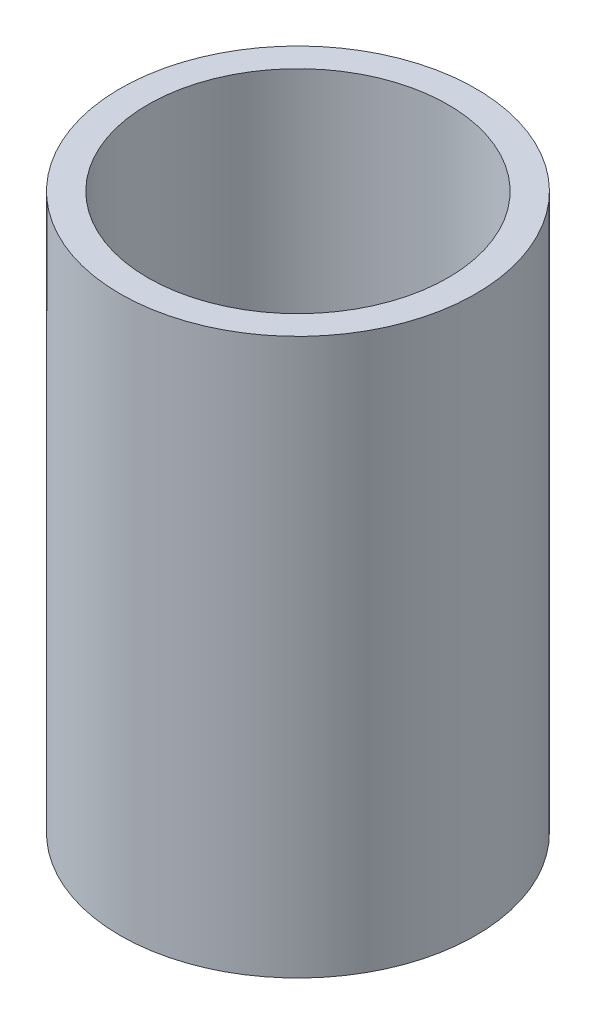
ISO-10303-21;
HEADER;
FILE_DESCRIPTION(('STEP AP214'),'2;1');
FILE_NAME('part.step','',(''),(''),'','','');
FILE_SCHEMA(('AUTOMOTIVE_DESIGN { 1 0 10303 214 1 1 1 1 }'));
ENDSEC;
DATA;
#1=APPLICATION_CONTEXT('core data for automotive mechanical design processes');
#2=APPLICATION_PROTOCOL_DEFINITION('international standard','automotive_design',2000,#1);
#3=PRODUCT_CONTEXT('',#1,'mechanical');
#4=PRODUCT('Part','Part','',(#3));
#5=PRODUCT_RELATED_PRODUCT_CATEGORY('part','',(#4));
#6=PRODUCT_DEFINITION_FORMATION('','',#4);
#7=PRODUCT_DEFINITION_CONTEXT('part definition',#1,'design');
#8=PRODUCT_DEFINITION('design','',#6,#7);
#9=PRODUCT_DEFINITION_SHAPE('','',#8);
#10=(LENGTH_UNIT() NAMED_UNIT(*) SI_UNIT(.MILLI.,.METRE.));
#11=(NAMED_UNIT(*) PLANE_ANGLE_UNIT() SI_UNIT($,.RADIAN.));
#12=(NAMED_UNIT(*) SI_UNIT($,.STERADIAN.) SOLID_ANGLE_UNIT());
#13=UNCERTAINTY_MEASURE_WITH_UNIT(LENGTH_MEASURE(1.E-05),#10,'distance_accuracy_value','');
#14=(GEOMETRIC_REPRESENTATION_CONTEXT(3) GLOBAL_UNCERTAINTY_ASSIGNED_CONTEXT((#13)) GLOBAL_UNIT_ASSIGNED_CONTEXT((#10,
#11,#12)) REPRESENTATION_CONTEXT('',''));
#15=CARTESIAN_POINT('',(0.,0.,0.));
#16=DIRECTION('',(0.,0.,1.));
#17=DIRECTION('',(1.,0.,0.));
#18=AXIS2_PLACEMENT_3D('',#15,#16,#17);
#19=CARTESIAN_POINT('',(0.,100.,0.));
#20=DIRECTION('',(0.,-1.,0.));
#21=DIRECTION('',(0.,0.,-1.));
#22=AXIS2_PLACEMENT_3D('',#19,#20,#21);
#23=CYLINDRICAL_SURFACE('',#22,32.);
#24=CARTESIAN_POINT('',(0.,100.,0.));
#25=DIRECTION('',(0.,1.,0.));
#26=DIRECTION('',(0.,0.,1.));
#27=AXIS2_PLACEMENT_3D('',#24,#25,#26);
#28=CIRCLE('',#27,32.);
#29=CARTESIAN_POINT('',(0.,100.,32.));
#30=VERTEX_POINT('',#29);
#31=EDGE_CURVE('E123',#30,#30,#28,.T.);
#32=ORIENTED_EDGE('',*,*,#31,.F.);
#33=EDGE_LOOP('',(#32));
#34=FACE_BOUND('',#33,.T.);
#35=CARTESIAN_POINT('',(0.,0.,0.));
#36=DIRECTION('',(0.,1.,0.));
#37=DIRECTION('',(0.,0.,1.));
#38=AXIS2_PLACEMENT_3D('',#35,#36,#37);
#39=CIRCLE('',#38,32.);
#40=CARTESIAN_POINT('',(0.,0.,32.));
#41=VERTEX_POINT('',#40);
#42=EDGE_CURVE('E119',#41,#41,#39,.T.);
#43=ORIENTED_EDGE('',*,*,#42,.T.);
#44=EDGE_LOOP('',(#43));
#45=FACE_BOUND('',#44,.T.);
#46=ADVANCED_FACE('F39',(#34,#45),#23,.T.);
#47=CARTESIAN_POINT('',(0.,100.,0.));
#48=DIRECTION('',(0.,1.,0.));
#49=DIRECTION('',(0.,0.,1.));
#50=AXIS2_PLACEMENT_3D('',#47,#48,#49);
#51=PLANE('',#50);
#52=CARTESIAN_POINT('',(0.,100.,0.));
#53=DIRECTION('',(0.,1.,0.));
#54=DIRECTION('',(0.,0.,1.));
#55=AXIS2_PLACEMENT_3D('',#52,#53,#54);
#56=CIRCLE('',#55,27.);
#57=CARTESIAN_POINT('',(0.,100.,27.));
#58=VERTEX_POINT('',#57);
#59=EDGE_CURVE('E110',#58,#58,#56,.T.);
#60=ORIENTED_EDGE('',*,*,#59,.F.);
#61=EDGE_LOOP('',(#60));
#62=FACE_BOUND('',#61,.T.);
#63=ORIENTED_EDGE('',*,*,#31,.T.);
#64=EDGE_LOOP('',(#63));
#65=FACE_BOUND('',#64,.T.);
#66=ADVANCED_FACE('F156',(#62,#65),#51,.T.);
#67=CARTESIAN_POINT('',(0.,0.,0.));
#68=DIRECTION('',(0.,1.,0.));
#69=DIRECTION('',(0.,0.,1.));
#70=AXIS2_PLACEMENT_3D('',#67,#68,#69);
#71=PLANE('',#70);
#72=DIRECTION('',(-1.,0.,0.));
#73=VECTOR('',#72,1.);
#74=CARTESIAN_POINT('',(-14.,0.,14.));
#75=LINE('',#74,#73);
#76=CARTESIAN_POINT('',(14.,0.,14.));
#77=VERTEX_POINT('',#76);
#78=CARTESIAN_POINT('',(-14.,0.,14.));
#79=VERTEX_POINT('',#78);
#80=EDGE_CURVE('E92',#77,#79,#75,.T.);
#81=ORIENTED_EDGE('',*,*,#80,.F.);
#82=DIRECTION('',(0.,0.,1.));
#83=VECTOR('',#82,1.);
#84=CARTESIAN_POINT('',(14.,0.,14.));
#85=LINE('',#84,#83);
#86=CARTESIAN_POINT('',(14.,0.,-14.));
#87=VERTEX_POINT('',#86);
#88=EDGE_CURVE('E54',#87,#77,#85,.T.);
#89=ORIENTED_EDGE('',*,*,#88,.F.);
#90=DIRECTION('',(1.,0.,0.));
#91=VECTOR('',#90,1.);
#92=CARTESIAN_POINT('',(-14.,0.,-14.));
#93=LINE('',#92,#91);
#94=CARTESIAN_POINT('',(-14.,0.,-14.));
#95=VERTEX_POINT('',#94);
#96=EDGE_CURVE('E100',#95,#87,#93,.T.);
#97=ORIENTED_EDGE('',*,*,#96,.F.);
#98=DIRECTION('',(0.,0.,-1.));
#99=VECTOR('',#98,1.);
#100=CARTESIAN_POINT('',(-14.,0.,14.));
#101=LINE('',#100,#99);
#102=EDGE_CURVE('E82',#79,#95,#101,.T.);
#103=ORIENTED_EDGE('',*,*,#102,.F.);
#104=EDGE_LOOP('',(#81,#89,#97,#103));
#105=FACE_BOUND('',#104,.T.);
#106=ORIENTED_EDGE('',*,*,#42,.F.);
#107=EDGE_LOOP('',(#106));
#108=FACE_BOUND('',#107,.T.);
#109=ADVANCED_FACE('F97',(#105,#108),#71,.F.);
#110=CARTESIAN_POINT('',(0.,15.,0.));
#111=DIRECTION('',(0.,1.,0.));
#112=DIRECTION('',(0.,0.,1.));
#113=AXIS2_PLACEMENT_3D('',#110,#111,#112);
#114=CYLINDRICAL_SURFACE('',#113,27.);
#115=CARTESIAN_POINT('',(0.,15.,0.));
#116=DIRECTION('',(0.,1.,0.));
#117=DIRECTION('',(0.,0.,1.));
#118=AXIS2_PLACEMENT_3D('',#115,#116,#117);
#119=CIRCLE('',#118,27.);
#120=CARTESIAN_POINT('',(0.,15.,27.));
#121=VERTEX_POINT('',#120);
#122=EDGE_CURVE('E115',#121,#121,#119,.T.);
#123=ORIENTED_EDGE('',*,*,#122,.F.);
#124=EDGE_LOOP('',(#123));
#125=FACE_BOUND('',#124,.T.);
#126=ORIENTED_EDGE('',*,*,#59,.T.);
#127=EDGE_LOOP('',(#126));
#128=FACE_BOUND('',#127,.T.);
#129=ADVANCED_FACE('F152',(#125,#128),#114,.F.);
#130=CARTESIAN_POINT('',(0.,15.,0.));
#131=DIRECTION('',(0.,1.,0.));
#132=DIRECTION('',(0.,0.,1.));
#133=AXIS2_PLACEMENT_3D('',#130,#131,#132);
#134=PLANE('',#133);
#135=DIRECTION('',(0.,0.,-1.));
#136=VECTOR('',#135,1.);
#137=CARTESIAN_POINT('',(14.,15.,0.));
#138=LINE('',#137,#136);
#139=CARTESIAN_POINT('',(14.,15.,14.));
#140=VERTEX_POINT('',#139);
#141=CARTESIAN_POINT('',(14.,15.,-14.));
#142=VERTEX_POINT('',#141);
#143=EDGE_CURVE('E11',#140,#142,#138,.T.);
#144=ORIENTED_EDGE('',*,*,#143,.F.);
#145=DIRECTION('',(1.,0.,0.));
#146=VECTOR('',#145,1.);
#147=CARTESIAN_POINT('',(0.,15.,14.));
#148=LINE('',#147,#146);
#149=CARTESIAN_POINT('',(-14.,15.,14.));
#150=VERTEX_POINT('',#149);
#151=EDGE_CURVE('E127',#150,#140,#148,.T.);
#152=ORIENTED_EDGE('',*,*,#151,.F.);
#153=DIRECTION('',(0.,0.,1.));
#154=VECTOR('',#153,1.);
#155=CARTESIAN_POINT('',(-14.,15.,0.));
#156=LINE('',#155,#154);
#157=CARTESIAN_POINT('',(-14.,15.,-14.));
#158=VERTEX_POINT('',#157);
#159=EDGE_CURVE('E85',#158,#150,#156,.T.);
#160=ORIENTED_EDGE('',*,*,#159,.F.);
#161=DIRECTION('',(-1.,0.,0.));
#162=VECTOR('',#161,1.);
#163=CARTESIAN_POINT('',(0.,15.,-14.));
#164=LINE('',#163,#162);
#165=EDGE_CURVE('E47',#142,#158,#164,.T.);
#166=ORIENTED_EDGE('',*,*,#165,.F.);
#167=EDGE_LOOP('',(#144,#152,#160,#166));
#168=FACE_BOUND('',#167,.T.);
#169=ORIENTED_EDGE('',*,*,#122,.T.);
#170=EDGE_LOOP('',(#169));
#171=FACE_BOUND('',#170,.T.);
#172=ADVANCED_FACE('F141',(#168,#171),#134,.T.);
#173=CARTESIAN_POINT('',(14.,25.,14.));
#174=DIRECTION('',(1.,0.,0.));
#175=DIRECTION('',(0.,0.,-1.));
#176=AXIS2_PLACEMENT_3D('',#173,#174,#175);
#177=PLANE('',#176);
#178=ORIENTED_EDGE('',*,*,#143,.T.);
#179=DIRECTION('',(0.,-1.,0.));
#180=VECTOR('',#179,1.);
#181=CARTESIAN_POINT('',(14.,25.,-14.));
#182=LINE('',#181,#180);
#183=EDGE_CURVE('E107',#142,#87,#182,.T.);
#184=ORIENTED_EDGE('',*,*,#183,.T.);
#185=ORIENTED_EDGE('',*,*,#88,.T.);
#186=DIRECTION('',(0.,-1.,0.));
#187=VECTOR('',#186,1.);
#188=CARTESIAN_POINT('',(14.,25.,14.));
#189=LINE('',#188,#187);
#190=EDGE_CURVE('E89',#140,#77,#189,.T.);
#191=ORIENTED_EDGE('',*,*,#190,.F.);
#192=EDGE_LOOP('',(#178,#184,#185,#191));
#193=FACE_BOUND('',#192,.T.);
#194=ADVANCED_FACE('F143',(#193),#177,.F.);
#195=CARTESIAN_POINT('',(-14.,25.,-14.));
#196=DIRECTION('',(0.,0.,-1.));
#197=DIRECTION('',(-1.,0.,0.));
#198=AXIS2_PLACEMENT_3D('',#195,#196,#197);
#199=PLANE('',#198);
#200=ORIENTED_EDGE('',*,*,#165,.T.);
#201=DIRECTION('',(0.,-1.,0.));
#202=VECTOR('',#201,1.);
#203=CARTESIAN_POINT('',(-14.,25.,-14.));
#204=LINE('',#203,#202);
#205=EDGE_CURVE('E88',#158,#95,#204,.T.);
#206=ORIENTED_EDGE('',*,*,#205,.T.);
#207=ORIENTED_EDGE('',*,*,#96,.T.);
#208=ORIENTED_EDGE('',*,*,#183,.F.);
#209=EDGE_LOOP('',(#200,#206,#207,#208));
#210=FACE_BOUND('',#209,.T.);
#211=ADVANCED_FACE('F138',(#210),#199,.F.);
#212=CARTESIAN_POINT('',(-14.,25.,14.));
#213=DIRECTION('',(-1.,0.,0.));
#214=DIRECTION('',(0.,0.,1.));
#215=AXIS2_PLACEMENT_3D('',#212,#213,#214);
#216=PLANE('',#215);
#217=ORIENTED_EDGE('',*,*,#159,.T.);
#218=DIRECTION('',(0.,-1.,0.));
#219=VECTOR('',#218,1.);
#220=CARTESIAN_POINT('',(-14.,25.,14.));
#221=LINE('',#220,#219);
#222=EDGE_CURVE('E62',#150,#79,#221,.T.);
#223=ORIENTED_EDGE('',*,*,#222,.T.);
#224=ORIENTED_EDGE('',*,*,#102,.T.);
#225=ORIENTED_EDGE('',*,*,#205,.F.);
#226=EDGE_LOOP('',(#217,#223,#224,#225));
#227=FACE_BOUND('',#226,.T.);
#228=ADVANCED_FACE('F79',(#227),#216,.F.);
#229=CARTESIAN_POINT('',(-14.,25.,14.));
#230=DIRECTION('',(0.,0.,1.));
#231=DIRECTION('',(1.,0.,0.));
#232=AXIS2_PLACEMENT_3D('',#229,#230,#231);
#233=PLANE('',#232);
#234=ORIENTED_EDGE('',*,*,#151,.T.);
#235=ORIENTED_EDGE('',*,*,#190,.T.);
#236=ORIENTED_EDGE('',*,*,#80,.T.);
#237=ORIENTED_EDGE('',*,*,#222,.F.);
#238=EDGE_LOOP('',(#234,#235,#236,#237));
#239=FACE_BOUND('',#238,.T.);
#240=ADVANCED_FACE('F93',(#239),#233,.F.);
#241=CLOSED_SHELL('',(#46,#66,#109,#129,#172,#194,#211,#228,#240));
#242=MANIFOLD_SOLID_BREP('B2',#241);
#243=ADVANCED_BREP_SHAPE_REPRESENTATION('',(#18,#242),#14);
#244=SHAPE_DEFINITION_REPRESENTATION(#9,#243);
ENDSEC;
END-ISO-10303-21;
